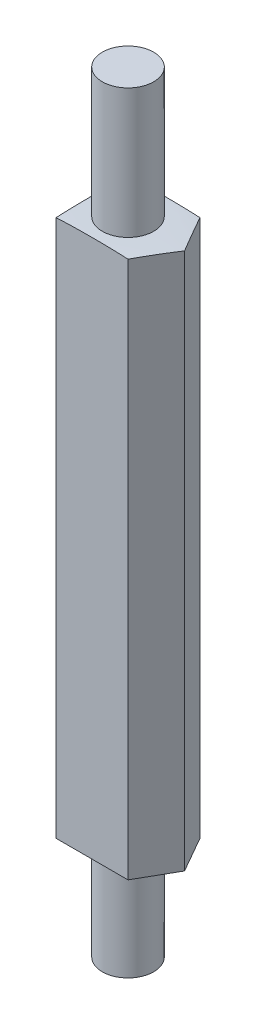
ISO-10303-21;
HEADER;
FILE_DESCRIPTION(('STEP AP214'),'2;1');
FILE_NAME('part.step','',(''),(''),'','','');
FILE_SCHEMA(('AUTOMOTIVE_DESIGN { 1 0 10303 214 1 1 1 1 }'));
ENDSEC;
DATA;
#1=APPLICATION_CONTEXT('core data for automotive mechanical design processes');
#2=APPLICATION_PROTOCOL_DEFINITION('international standard','automotive_design',2000,#1);
#3=PRODUCT_CONTEXT('',#1,'mechanical');
#4=PRODUCT('Part','Part','',(#3));
#5=PRODUCT_RELATED_PRODUCT_CATEGORY('part','',(#4));
#6=PRODUCT_DEFINITION_FORMATION('','',#4);
#7=PRODUCT_DEFINITION_CONTEXT('part definition',#1,'design');
#8=PRODUCT_DEFINITION('design','',#6,#7);
#9=PRODUCT_DEFINITION_SHAPE('','',#8);
#10=(LENGTH_UNIT() NAMED_UNIT(*) SI_UNIT(.MILLI.,.METRE.));
#11=(NAMED_UNIT(*) PLANE_ANGLE_UNIT() SI_UNIT($,.RADIAN.));
#12=(NAMED_UNIT(*) SI_UNIT($,.STERADIAN.) SOLID_ANGLE_UNIT());
#13=UNCERTAINTY_MEASURE_WITH_UNIT(LENGTH_MEASURE(1.E-05),#10,'distance_accuracy_value','');
#14=(GEOMETRIC_REPRESENTATION_CONTEXT(3) GLOBAL_UNCERTAINTY_ASSIGNED_CONTEXT((#13)) GLOBAL_UNIT_ASSIGNED_CONTEXT((#10,
#11,#12)) REPRESENTATION_CONTEXT('',''));
#15=CARTESIAN_POINT('',(0.,0.,0.));
#16=DIRECTION('',(0.,0.,1.));
#17=DIRECTION('',(1.,0.,0.));
#18=AXIS2_PLACEMENT_3D('',#15,#16,#17);
#19=CARTESIAN_POINT('',(0.,44.8,0.));
#20=DIRECTION('',(0.,-1.,0.));
#21=DIRECTION('',(0.,0.,1.));
#22=AXIS2_PLACEMENT_3D('',#19,#20,#21);
#23=DEGENERATE_TOROIDAL_SURFACE('',#22,5.00000000000002,60.,.T.);
#24=CARTESIAN_POINT('',(-35.4807056837129,96.0714913568184,-7.));
#25=CARTESIAN_POINT('',(-34.7704602372961,96.49505391938,-7.));
#26=CARTESIAN_POINT('',(-34.0514374149317,96.9038920899398,-7.));
#27=CARTESIAN_POINT('',(-32.597126199639,97.6914925336975,-7.));
#28=CARTESIAN_POINT('',(-31.8618382031194,98.0702555388455,-7.));
#29=CARTESIAN_POINT('',(-30.3749060560666,98.7977573102285,-7.));
#30=CARTESIAN_POINT('',(-29.6232346986543,99.1464404662368,-7.));
#31=CARTESIAN_POINT('',(-28.1061283770773,99.8124841908434,-7.));
#32=CARTESIAN_POINT('',(-27.3406932095398,100.129844296165,-7.));
#33=CARTESIAN_POINT('',(-25.7980679917241,100.732517194497,-7.));
#34=CARTESIAN_POINT('',(-25.0208885953051,101.017857261764,-7.));
#35=CARTESIAN_POINT('',(-23.4555177200102,101.556425468979,-7.));
#36=CARTESIAN_POINT('',(-22.667326682778,101.809654892708,-7.));
#37=CARTESIAN_POINT('',(-21.0824187831595,102.283415888684,-7.));
#38=CARTESIAN_POINT('',(-20.2857158023585,102.503993931897,-7.));
#39=CARTESIAN_POINT('',(-18.6839303270961,102.912798037602,-7.));
#40=CARTESIAN_POINT('',(-17.878846722126,103.10101975319,-7.));
#41=CARTESIAN_POINT('',(-16.4601673648762,103.402944054347,-7.));
#42=CARTESIAN_POINT('',(-15.8480401862005,103.523600752918,-7.));
#43=CARTESIAN_POINT('',(-14.6204708078111,103.746660971418,-7.));
#44=CARTESIAN_POINT('',(-14.0050286400032,103.849064666704,-7.));
#45=CARTESIAN_POINT('',(-12.7714919846752,104.035887047731,-7.));
#46=CARTESIAN_POINT('',(-12.1533977775346,104.120307589115,-7.));
#47=CARTESIAN_POINT('',(-10.9150842307115,104.271661975545,-7.));
#48=CARTESIAN_POINT('',(-10.2948649120304,104.338595992898,-7.));
#49=CARTESIAN_POINT('',(-9.05109061822959,104.455946089074,-7.));
#50=CARTESIAN_POINT('',(-8.42753117459116,104.506314516893,-7.));
#51=CARTESIAN_POINT('',(-7.17937113919081,104.591575298752,-7.));
#52=CARTESIAN_POINT('',(-6.55477055135328,104.626467710994,-7.));
#53=CARTESIAN_POINT('',(-5.30480983647563,104.682807824537,-7.));
#54=CARTESIAN_POINT('',(-4.67944954798173,104.704251831856,-7.00000000000001));
#55=CARTESIAN_POINT('',(-3.42846119692229,104.736593850282,-7.00000000000001));
#56=CARTESIAN_POINT('',(-2.80283312942295,104.747491657898,-7.));
#57=CARTESIAN_POINT('',(-1.86381971453881,104.758328886007,-7.00000000000001));
#58=CARTESIAN_POINT('',(-1.5504602028737,104.761022990333,-7.00000000000001));
#59=CARTESIAN_POINT('',(-0.923731211433339,104.764859728087,-7.00000000000001));
#60=CARTESIAN_POINT('',(-0.610361731657584,104.766002361438,-7.00000000000001));
#61=CARTESIAN_POINT('',(0.0163794553882462,104.766891718648,-7.00000000000001));
#62=CARTESIAN_POINT('',(0.329751162660568,104.766638440809,-7.00000000000001));
#63=CARTESIAN_POINT('',(0.956489672090149,104.764695357435,-7.00000000000001));
#64=CARTESIAN_POINT('',(1.2698564742473,104.763005551867,-7.00000000000001));
#65=CARTESIAN_POINT('',(2.2098696019706,104.75548808701,-7.00000000000001));
#66=CARTESIAN_POINT('',(2.83650100265556,104.747212554719,-7.00000000000001));
#67=CARTESIAN_POINT('',(4.08956851822759,104.721134489193,-7.00000000000001));
#68=CARTESIAN_POINT('',(4.71600463680264,104.703332148346,-7.00000000000001));
#69=CARTESIAN_POINT('',(5.96702324365867,104.655097305368,-7.00000000000001));
#70=CARTESIAN_POINT('',(6.59160676867303,104.624692805798,-7.00000000000001));
#71=CARTESIAN_POINT('',(7.83988746239251,104.548967859024,-7.00000000000001));
#72=CARTESIAN_POINT('',(8.46358462481576,104.50364730663,-7.00000000000001));
#73=CARTESIAN_POINT('',(9.70947533513393,104.396591956521,-7.00000000000001));
#74=CARTESIAN_POINT('',(10.3316691225465,104.334859975081,-7.00000000000001));
#75=CARTESIAN_POINT('',(11.5740751772015,104.194047974128,-7.00000000000001));
#76=CARTESIAN_POINT('',(12.194287473447,104.114968209725,-7.00000000000001));
#77=CARTESIAN_POINT('',(13.8117819250366,103.88486006564,-7.00000000000001));
#78=CARTESIAN_POINT('',(14.8070627646019,103.719448689205,-7.00000000000001));
#79=CARTESIAN_POINT('',(16.7885426974355,103.340695638787,-7.00000000000001));
#80=CARTESIAN_POINT('',(17.7747409758519,103.127349707081,-7.00000000000001));
#81=CARTESIAN_POINT('',(19.7363113179881,102.652211092633,-7.00000000000001));
#82=CARTESIAN_POINT('',(20.7116733754322,102.390377032747,-7.00000000000001));
#83=CARTESIAN_POINT('',(22.6481388471026,101.818547728553,-7.00000000000001));
#84=CARTESIAN_POINT('',(23.6092428255693,101.50855439567,-7.00000000000001));
#85=CARTESIAN_POINT('',(25.5115031707594,100.842010692062,-7.00000000000001));
#86=CARTESIAN_POINT('',(26.4527162583502,100.485622232716,-7.00000000000001));
#87=CARTESIAN_POINT('',(28.3161315509829,99.7261800127529,-7.00000000000001));
#88=CARTESIAN_POINT('',(29.2383336756878,99.323126054984,-7.00000000000001));
#89=CARTESIAN_POINT('',(31.0612405452625,98.4712850570906,-7.00000000000001));
#90=CARTESIAN_POINT('',(31.9619477688597,98.0225033219165,-7.00000000000001));
#91=CARTESIAN_POINT('',(33.7396707909722,97.0802472328056,-7.00000000000001));
#92=CARTESIAN_POINT('',(34.6166866219999,96.586772940206,-7.00000000000001));
#93=CARTESIAN_POINT('',(35.4807056837128,96.0714913568184,-7.00000000000002));
#94=B_SPLINE_CURVE_WITH_KNOTS('',3,(#24,#25,#26,#27,#28,#29,#30,#31,#32,#33,#34,#35,#36,#37,#38,
#39,#40,#41,#42,#43,#44,#45,#46,#47,#48,#49,#50,#51,#52,#53,#54,#55,#56,#57,#58,#59,#60,#61,#62,
#63,#64,#65,#66,#67,#68,#69,#70,#71,#72,#73,#74,#75,#76,#77,#78,#79,#80,#81,#82,#83,#84,#85,#86,
#87,#88,#89,#90,#91,#92,#93),.UNSPECIFIED.,.F.,.F.,(4,2,2,2,2,2,2,2,2,2,2,2,2,2,2,2,2,2,2,2,2,2,
2,2,2,2,2,2,2,2,2,2,2,2,4),(0.,2.48068189157886,4.96130339139055,7.44641683002163,
9.93156701867196,12.4145840577446,14.8975017947894,17.3768510303997,19.8565330937413,
21.7279859418865,23.5994208099274,25.470662474853,27.3418857003034,29.2184453674426,
31.0949979771783,32.9720658090746,34.8491698584172,35.7892807343555,36.729391656888,
37.669503723195,38.6096158106664,40.4896229316514,42.3695920885385,44.245406076272,
46.1212332927393,47.9967388163297,49.872216761132,52.8977959569839,55.9236440022057,
58.9520861413772,61.9804081134466,64.9984316797057,68.0164679969994,71.0341545850014,
74.0518370315093),.UNSPECIFIED.);
#95=CARTESIAN_POINT('',(-7.00000000000003,104.599623321273,-7.));
#96=VERTEX_POINT('',#95);
#97=CARTESIAN_POINT('',(6.99999999999998,104.599623321273,-7.00000000000001));
#98=VERTEX_POINT('',#97);
#99=EDGE_CURVE('E106',#96,#98,#94,.T.);
#100=ORIENTED_EDGE('',*,*,#99,.F.);
#101=CARTESIAN_POINT('',(-7.00000000000003,96.0714913568184,35.4807056837128));
#102=CARTESIAN_POINT('',(-7.00000000000003,96.49505391938,34.770460237296));
#103=CARTESIAN_POINT('',(-7.00000000000003,96.9038920899398,34.0514374149317));
#104=CARTESIAN_POINT('',(-7.00000000000003,97.6914925336975,32.597126199639));
#105=CARTESIAN_POINT('',(-7.00000000000003,98.0702555388455,31.8618382031193));
#106=CARTESIAN_POINT('',(-7.00000000000003,98.7977573102285,30.3749060560665));
#107=CARTESIAN_POINT('',(-7.00000000000003,99.1464404662369,29.6232346986543));
#108=CARTESIAN_POINT('',(-7.00000000000003,99.8124841908434,28.1061283770772));
#109=CARTESIAN_POINT('',(-7.00000000000003,100.129844296165,27.3406932095397));
#110=CARTESIAN_POINT('',(-7.00000000000003,100.732517194497,25.798067991724));
#111=CARTESIAN_POINT('',(-7.00000000000003,101.017857261764,25.0208885953051));
#112=CARTESIAN_POINT('',(-7.00000000000003,101.556425468979,23.4555177200102));
#113=CARTESIAN_POINT('',(-7.00000000000003,101.809654892708,22.6673266827779));
#114=CARTESIAN_POINT('',(-7.00000000000003,102.283415888684,21.0824187831594));
#115=CARTESIAN_POINT('',(-7.00000000000003,102.503993931897,20.2857158023585));
#116=CARTESIAN_POINT('',(-7.00000000000003,102.912798037602,18.6839303270961));
#117=CARTESIAN_POINT('',(-7.00000000000003,103.10101975319,17.878846722126));
#118=CARTESIAN_POINT('',(-7.00000000000003,103.402944054347,16.4601673648762));
#119=CARTESIAN_POINT('',(-7.00000000000003,103.523600752918,15.8480401862005));
#120=CARTESIAN_POINT('',(-7.00000000000003,103.746660971418,14.6204708078111));
#121=CARTESIAN_POINT('',(-7.00000000000003,103.849064666704,14.0050286400032));
#122=CARTESIAN_POINT('',(-7.00000000000003,104.035887047731,12.7714919846751));
#123=CARTESIAN_POINT('',(-7.00000000000003,104.120307589115,12.1533977775346));
#124=CARTESIAN_POINT('',(-7.00000000000003,104.271661975545,10.9150842307115));
#125=CARTESIAN_POINT('',(-7.00000000000003,104.338595992898,10.2948649120304));
#126=CARTESIAN_POINT('',(-7.00000000000003,104.455946089074,9.05109061822957));
#127=CARTESIAN_POINT('',(-7.00000000000003,104.506314516893,8.42753117459114));
#128=CARTESIAN_POINT('',(-7.00000000000003,104.591575298752,7.17937113919079));
#129=CARTESIAN_POINT('',(-7.00000000000003,104.626467710994,6.55477055135326));
#130=CARTESIAN_POINT('',(-7.00000000000003,104.682807824537,5.30480983647561));
#131=CARTESIAN_POINT('',(-7.00000000000003,104.704251831856,4.67944954798171));
#132=CARTESIAN_POINT('',(-7.00000000000003,104.736593850282,3.42846119692227));
#133=CARTESIAN_POINT('',(-7.00000000000003,104.747491657898,2.80283312942293));
#134=CARTESIAN_POINT('',(-7.00000000000003,104.758328886007,1.86381971453879));
#135=CARTESIAN_POINT('',(-7.00000000000003,104.761022990333,1.55046020287368));
#136=CARTESIAN_POINT('',(-7.00000000000003,104.764859728087,0.923731211433315));
#137=CARTESIAN_POINT('',(-7.00000000000003,104.766002361438,0.61036173165756));
#138=CARTESIAN_POINT('',(-7.00000000000003,104.766891718648,-0.0163794553882718));
#139=CARTESIAN_POINT('',(-7.00000000000003,104.766638440809,-0.329751162660594));
#140=CARTESIAN_POINT('',(-7.00000000000003,104.764695357435,-0.956489672090177));
#141=CARTESIAN_POINT('',(-7.00000000000003,104.763005551867,-1.26985647424733));
#142=CARTESIAN_POINT('',(-7.00000000000003,104.75548808701,-2.20986960197063));
#143=CARTESIAN_POINT('',(-7.00000000000003,104.747212554719,-2.83650100265559));
#144=CARTESIAN_POINT('',(-7.00000000000003,104.721134489193,-4.08956851822761));
#145=CARTESIAN_POINT('',(-7.00000000000003,104.703332148346,-4.71600463680267));
#146=CARTESIAN_POINT('',(-7.00000000000003,104.655097305368,-5.9670232436587));
#147=CARTESIAN_POINT('',(-7.00000000000003,104.624692805798,-6.59160676867305));
#148=CARTESIAN_POINT('',(-7.00000000000003,104.548967859024,-7.83988746239254));
#149=CARTESIAN_POINT('',(-7.00000000000003,104.50364730663,-8.46358462481579));
#150=CARTESIAN_POINT('',(-7.00000000000003,104.396591956521,-9.70947533513396));
#151=CARTESIAN_POINT('',(-7.00000000000003,104.334859975081,-10.3316691225465));
#152=CARTESIAN_POINT('',(-7.00000000000003,104.194047974128,-11.5740751772015));
#153=CARTESIAN_POINT('',(-7.00000000000003,104.114968209725,-12.194287473447));
#154=CARTESIAN_POINT('',(-7.00000000000003,103.88486006564,-13.8117819250366));
#155=CARTESIAN_POINT('',(-7.00000000000003,103.719448689205,-14.8070627646019));
#156=CARTESIAN_POINT('',(-7.00000000000003,103.340695638787,-16.7885426974355));
#157=CARTESIAN_POINT('',(-7.00000000000003,103.127349707081,-17.7747409758519));
#158=CARTESIAN_POINT('',(-7.00000000000003,102.652211092633,-19.7363113179882));
#159=CARTESIAN_POINT('',(-7.00000000000003,102.390377032747,-20.7116733754322));
#160=CARTESIAN_POINT('',(-7.00000000000003,101.818547728553,-22.6481388471026));
#161=CARTESIAN_POINT('',(-7.00000000000003,101.50855439567,-23.6092428255693));
#162=CARTESIAN_POINT('',(-7.00000000000003,100.842010692062,-25.5115031707594));
#163=CARTESIAN_POINT('',(-7.00000000000003,100.485622232716,-26.4527162583502));
#164=CARTESIAN_POINT('',(-7.00000000000003,99.7261800127529,-28.316131550983));
#165=CARTESIAN_POINT('',(-7.00000000000003,99.323126054984,-29.2383336756879));
#166=CARTESIAN_POINT('',(-7.00000000000003,98.4712850570906,-31.0612405452625));
#167=CARTESIAN_POINT('',(-7.00000000000003,98.0225033219165,-31.9619477688598));
#168=CARTESIAN_POINT('',(-7.00000000000003,97.0802472328056,-33.7396707909722));
#169=CARTESIAN_POINT('',(-7.00000000000003,96.586772940206,-34.6166866219999));
#170=CARTESIAN_POINT('',(-7.00000000000003,96.0714913568184,-35.4807056837128));
#171=B_SPLINE_CURVE_WITH_KNOTS('',3,(#101,#102,#103,#104,#105,#106,#107,#108,#109,#110,#111,
#112,#113,#114,#115,#116,#117,#118,#119,#120,#121,#122,#123,#124,#125,#126,#127,#128,#129,#130,
#131,#132,#133,#134,#135,#136,#137,#138,#139,#140,#141,#142,#143,#144,#145,#146,#147,#148,#149,
#150,#151,#152,#153,#154,#155,#156,#157,#158,#159,#160,#161,#162,#163,#164,#165,#166,#167,#168,
#169,#170),.UNSPECIFIED.,.F.,.F.,(4,2,2,2,2,2,2,2,2,2,2,2,2,2,2,2,2,2,2,2,2,2,2,2,2,2,2,2,2,2,2,
2,2,2,4),(0.,2.48068189157885,4.96130339139056,7.44641683002164,9.93156701867196,
12.4145840577446,14.8975017947894,17.3768510303997,19.8565330937413,21.7279859418865,
23.5994208099274,25.470662474853,27.3418857003034,29.2184453674426,31.0949979771783,
32.9720658090746,34.8491698584172,35.7892807343555,36.729391656888,37.669503723195,
38.6096158106664,40.4896229316514,42.3695920885385,44.245406076272,46.1212332927393,
47.9967388163297,49.872216761132,52.8977959569839,55.9236440022057,58.9520861413772,
61.9804081134466,64.9984316797057,68.0164679969994,71.0341545850013,74.0518370315093),.UNSPECIFIED.);
#172=CARTESIAN_POINT('',(-7.00000000000003,104.599623321273,6.99999999999999));
#173=VERTEX_POINT('',#172);
#174=EDGE_CURVE('E92',#173,#96,#171,.T.);
#175=ORIENTED_EDGE('',*,*,#174,.F.);
#176=CARTESIAN_POINT('',(35.4807056837128,96.0714913568184,7.));
#177=CARTESIAN_POINT('',(34.770460237296,96.49505391938,7.));
#178=CARTESIAN_POINT('',(34.0514374149317,96.9038920899398,7.));
#179=CARTESIAN_POINT('',(32.597126199639,97.6914925336975,7.));
#180=CARTESIAN_POINT('',(31.8618382031193,98.0702555388455,7.));
#181=CARTESIAN_POINT('',(30.3749060560665,98.7977573102285,7.));
#182=CARTESIAN_POINT('',(29.6232346986543,99.1464404662369,7.));
#183=CARTESIAN_POINT('',(28.1061283770772,99.8124841908434,7.));
#184=CARTESIAN_POINT('',(27.3406932095397,100.129844296165,7.));
#185=CARTESIAN_POINT('',(25.798067991724,100.732517194497,7.));
#186=CARTESIAN_POINT('',(25.0208885953051,101.017857261764,7.));
#187=CARTESIAN_POINT('',(23.4555177200102,101.556425468979,7.));
#188=CARTESIAN_POINT('',(22.6673266827779,101.809654892708,7.));
#189=CARTESIAN_POINT('',(21.0824187831594,102.283415888684,7.));
#190=CARTESIAN_POINT('',(20.2857158023585,102.503993931897,7.));
#191=CARTESIAN_POINT('',(18.6839303270961,102.912798037602,7.));
#192=CARTESIAN_POINT('',(17.878846722126,103.10101975319,7.));
#193=CARTESIAN_POINT('',(16.4601673648762,103.402944054347,7.));
#194=CARTESIAN_POINT('',(15.8480401862005,103.523600752918,7.));
#195=CARTESIAN_POINT('',(14.6204708078111,103.746660971418,7.));
#196=CARTESIAN_POINT('',(14.0050286400032,103.849064666704,7.));
#197=CARTESIAN_POINT('',(12.7714919846751,104.035887047731,7.));
#198=CARTESIAN_POINT('',(12.1533977775346,104.120307589115,6.99999999999999));
#199=CARTESIAN_POINT('',(10.9150842307115,104.271661975545,6.99999999999999));
#200=CARTESIAN_POINT('',(10.2948649120304,104.338595992898,6.99999999999999));
#201=CARTESIAN_POINT('',(9.05109061822955,104.455946089074,6.99999999999999));
#202=CARTESIAN_POINT('',(8.42753117459113,104.506314516893,6.99999999999999));
#203=CARTESIAN_POINT('',(7.17937113919078,104.591575298752,6.99999999999999));
#204=CARTESIAN_POINT('',(6.55477055135324,104.626467710994,6.99999999999999));
#205=CARTESIAN_POINT('',(5.30480983647558,104.682807824537,6.99999999999999));
#206=CARTESIAN_POINT('',(4.67944954798168,104.704251831856,6.99999999999999));
#207=CARTESIAN_POINT('',(3.42846119692224,104.736593850282,6.99999999999999));
#208=CARTESIAN_POINT('',(2.80283312942291,104.747491657898,6.99999999999999));
#209=CARTESIAN_POINT('',(1.86381971453876,104.758328886007,6.99999999999999));
#210=CARTESIAN_POINT('',(1.55046020287366,104.761022990333,6.99999999999999));
#211=CARTESIAN_POINT('',(0.923731211433291,104.764859728087,6.99999999999999));
#212=CARTESIAN_POINT('',(0.610361731657538,104.766002361438,6.99999999999999));
#213=CARTESIAN_POINT('',(-0.0163794553882921,104.766891718648,6.99999999999999));
#214=CARTESIAN_POINT('',(-0.329751162660616,104.766638440809,6.99999999999999));
#215=CARTESIAN_POINT('',(-0.9564896720902,104.764695357435,6.99999999999999));
#216=CARTESIAN_POINT('',(-1.26985647424735,104.763005551867,6.99999999999999));
#217=CARTESIAN_POINT('',(-2.20986960197065,104.75548808701,6.99999999999999));
#218=CARTESIAN_POINT('',(-2.83650100265562,104.747212554719,6.99999999999999));
#219=CARTESIAN_POINT('',(-4.08956851822764,104.721134489193,6.99999999999999));
#220=CARTESIAN_POINT('',(-4.71600463680269,104.703332148346,6.99999999999999));
#221=CARTESIAN_POINT('',(-5.96702324365873,104.655097305368,6.99999999999999));
#222=CARTESIAN_POINT('',(-6.59160676867308,104.624692805798,6.99999999999999));
#223=CARTESIAN_POINT('',(-7.83988746239256,104.548967859024,6.99999999999999));
#224=CARTESIAN_POINT('',(-8.46358462481581,104.50364730663,6.99999999999999));
#225=CARTESIAN_POINT('',(-9.70947533513398,104.396591956521,6.99999999999999));
#226=CARTESIAN_POINT('',(-10.3316691225466,104.334859975081,6.99999999999999));
#227=CARTESIAN_POINT('',(-11.5740751772015,104.194047974128,6.99999999999999));
#228=CARTESIAN_POINT('',(-12.194287473447,104.114968209725,6.99999999999999));
#229=CARTESIAN_POINT('',(-13.8117819250366,103.88486006564,6.99999999999999));
#230=CARTESIAN_POINT('',(-14.807062764602,103.719448689205,6.99999999999999));
#231=CARTESIAN_POINT('',(-16.7885426974355,103.340695638787,6.99999999999999));
#232=CARTESIAN_POINT('',(-17.7747409758519,103.127349707081,6.99999999999999));
#233=CARTESIAN_POINT('',(-19.7363113179882,102.652211092633,6.99999999999999));
#234=CARTESIAN_POINT('',(-20.7116733754322,102.390377032747,6.99999999999999));
#235=CARTESIAN_POINT('',(-22.6481388471026,101.818547728553,6.99999999999999));
#236=CARTESIAN_POINT('',(-23.6092428255693,101.50855439567,6.99999999999999));
#237=CARTESIAN_POINT('',(-25.5115031707594,100.842010692062,6.99999999999999));
#238=CARTESIAN_POINT('',(-26.4527162583502,100.485622232716,6.99999999999999));
#239=CARTESIAN_POINT('',(-28.316131550983,99.7261800127529,6.99999999999999));
#240=CARTESIAN_POINT('',(-29.2383336756879,99.3231260549839,6.99999999999998));
#241=CARTESIAN_POINT('',(-31.0612405452625,98.4712850570905,6.99999999999998));
#242=CARTESIAN_POINT('',(-31.9619477688598,98.0225033219165,6.99999999999998));
#243=CARTESIAN_POINT('',(-33.7396707909722,97.0802472328056,6.99999999999998));
#244=CARTESIAN_POINT('',(-34.616686622,96.586772940206,6.99999999999998));
#245=CARTESIAN_POINT('',(-35.4807056837129,96.0714913568184,6.99999999999998));
#246=B_SPLINE_CURVE_WITH_KNOTS('',3,(#176,#177,#178,#179,#180,#181,#182,#183,#184,#185,#186,
#187,#188,#189,#190,#191,#192,#193,#194,#195,#196,#197,#198,#199,#200,#201,#202,#203,#204,#205,
#206,#207,#208,#209,#210,#211,#212,#213,#214,#215,#216,#217,#218,#219,#220,#221,#222,#223,#224,
#225,#226,#227,#228,#229,#230,#231,#232,#233,#234,#235,#236,#237,#238,#239,#240,#241,#242,#243,
#244,#245),.UNSPECIFIED.,.F.,.F.,(4,2,2,2,2,2,2,2,2,2,2,2,2,2,2,2,2,2,2,2,2,2,2,2,2,2,2,2,2,2,2,
2,2,2,4),(0.,2.48068189157884,4.96130339139054,7.44641683002161,9.93156701867194,
12.4145840577446,14.8975017947893,17.3768510303997,19.8565330937413,21.7279859418865,
23.5994208099274,25.470662474853,27.3418857003033,29.2184453674426,31.0949979771783,
32.9720658090746,34.8491698584172,35.7892807343555,36.729391656888,37.669503723195,
38.6096158106664,40.4896229316514,42.3695920885385,44.245406076272,46.1212332927393,
47.9967388163297,49.872216761132,52.8977959569839,55.9236440022057,58.9520861413772,
61.9804081134466,64.9984316797057,68.0164679969995,71.0341545850014,74.0518370315093),.UNSPECIFIED.);
#247=CARTESIAN_POINT('',(6.99999999999998,104.599623321273,6.99999999999999));
#248=VERTEX_POINT('',#247);
#249=EDGE_CURVE('E83',#248,#173,#246,.T.);
#250=ORIENTED_EDGE('',*,*,#249,.F.);
#251=CARTESIAN_POINT('',(11.0001142857143,104.499234739958,-0.000200000000007339));
#252=CARTESIAN_POINT('',(10.8335659396209,104.515976763209,0.291259605663315));
#253=CARTESIAN_POINT('',(10.6669740169347,104.530851205526,0.58279547036424));
#254=CARTESIAN_POINT('',(10.3337260818348,104.55714029033,1.16597935678904));
#255=CARTESIAN_POINT('',(10.1670700707665,104.568555001855,1.45762737615857));
#256=CARTESIAN_POINT('',(9.6671312060022,104.598017515691,2.3325203894961));
#257=CARTESIAN_POINT('',(9.33377689705853,104.611293476327,2.91589043014751));
#258=CARTESIAN_POINT('',(8.83371345516731,104.62288041425,3.79100145345716));
#259=CARTESIAN_POINT('',(8.66702315550597,104.625354921863,4.08270947786449));
#260=CARTESIAN_POINT('',(8.33363791336234,104.627602463484,4.66613365161585));
#261=CARTESIAN_POINT('',(8.16694297089873,104.627375507132,4.95784980092717));
#262=CARTESIAN_POINT('',(7.83350966874269,104.624219594798,5.54135807970025));
#263=CARTESIAN_POINT('',(7.6667713109416,104.62128983236,5.83315020585215));
#264=CARTESIAN_POINT('',(7.33331219522816,104.612604311848,6.41670365835068));
#265=CARTESIAN_POINT('',(7.16659143738181,104.606848543527,6.70846498458178));
#266=CARTESIAN_POINT('',(6.99988571428569,104.599618355216,7.00019999999999));
#267=B_SPLINE_CURVE_WITH_KNOTS('',3,(#251,#252,#253,#254,#255,#256,#257,#258,#259,#260,#261,
#262,#263,#264,#265,#266),.UNSPECIFIED.,.F.,.F.,(4,2,2,2,2,2,2,4),(0.,1.00830439187766,
2.01658866172778,4.03254815752321,5.04049351443931,6.04843527455549,7.05667787828032,
8.0649241376618),.UNSPECIFIED.);
#268=CARTESIAN_POINT('',(11.,104.499246226397,0.));
#269=VERTEX_POINT('',#268);
#270=EDGE_CURVE('E101',#269,#248,#267,.T.);
#271=ORIENTED_EDGE('',*,*,#270,.F.);
#272=CARTESIAN_POINT('',(6.99988571428569,104.599618355216,-7.00020000000001));
#273=CARTESIAN_POINT('',(7.16659143738181,104.606848543527,-6.70846498458179));
#274=CARTESIAN_POINT('',(7.33331219522816,104.612604311848,-6.41670365835069));
#275=CARTESIAN_POINT('',(7.6667713109416,104.62128983236,-5.83315020585216));
#276=CARTESIAN_POINT('',(7.83350966874269,104.624219594798,-5.54135807970026));
#277=CARTESIAN_POINT('',(8.16694297089873,104.627375507132,-4.95784980092718));
#278=CARTESIAN_POINT('',(8.33363791336234,104.627602463484,-4.66613365161586));
#279=CARTESIAN_POINT('',(8.66702315550598,104.625354921863,-4.0827094778645));
#280=CARTESIAN_POINT('',(8.83371345516731,104.62288041425,-3.79100145345717));
#281=CARTESIAN_POINT('',(9.33377689705854,104.611293476327,-2.91589043014752));
#282=CARTESIAN_POINT('',(9.6671312060022,104.598017515691,-2.33252038949611));
#283=CARTESIAN_POINT('',(10.1670700707665,104.568555001855,-1.45762737615858));
#284=CARTESIAN_POINT('',(10.3337260818348,104.55714029033,-1.16597935678905));
#285=CARTESIAN_POINT('',(10.6669740169347,104.530851205526,-0.582795470364252));
#286=CARTESIAN_POINT('',(10.8335659396209,104.515976763209,-0.291259605663327));
#287=CARTESIAN_POINT('',(11.0001142857143,104.499234739958,0.000199999999995854));
#288=B_SPLINE_CURVE_WITH_KNOTS('',3,(#272,#273,#274,#275,#276,#277,#278,#279,#280,#281,#282,
#283,#284,#285,#286,#287),.UNSPECIFIED.,.F.,.F.,(4,2,2,2,2,2,2,4),(0.,1.00824625938149,
2.01648886310632,3.02443062322249,4.0323759801386,6.04833547593403,7.05661974578415,
8.0649241376618),.UNSPECIFIED.);
#289=EDGE_CURVE('E108',#98,#269,#288,.T.);
#290=ORIENTED_EDGE('',*,*,#289,.F.);
#291=EDGE_LOOP('',(#100,#175,#250,#271,#290));
#292=FACE_BOUND('',#291,.T.);
#293=CARTESIAN_POINT('',(0.,104.8,0.));
#294=DIRECTION('',(0.,-1.,0.));
#295=DIRECTION('',(0.,0.,-1.));
#296=AXIS2_PLACEMENT_3D('',#293,#294,#295);
#297=CIRCLE('',#296,5.00000000000003);
#298=CARTESIAN_POINT('',(0.,104.8,-5.00000000000003));
#299=VERTEX_POINT('',#298);
#300=EDGE_CURVE('E93',#299,#299,#297,.F.);
#301=ORIENTED_EDGE('',*,*,#300,.F.);
#302=EDGE_LOOP('',(#301));
#303=FACE_BOUND('',#302,.T.);
#304=ADVANCED_FACE('F39',(#292,#303),#23,.T.);
#305=CARTESIAN_POINT('',(-7.00000000000003,104.802,6.99999999999999));
#306=DIRECTION('',(-1.,0.,0.));
#307=DIRECTION('',(0.,0.,1.));
#308=AXIS2_PLACEMENT_3D('',#305,#306,#307);
#309=PLANE('',#308);
#310=DIRECTION('',(0.,-1.,0.));
#311=VECTOR('',#310,1.);
#312=CARTESIAN_POINT('',(-7.00000000000003,104.802,6.99999999999999));
#313=LINE('',#312,#311);
#314=CARTESIAN_POINT('',(-7.00000000000003,0.,6.99999999999999));
#315=VERTEX_POINT('',#314);
#316=EDGE_CURVE('E86',#173,#315,#313,.T.);
#317=ORIENTED_EDGE('',*,*,#316,.F.);
#318=ORIENTED_EDGE('',*,*,#174,.T.);
#319=DIRECTION('',(0.,-1.,0.));
#320=VECTOR('',#319,1.);
#321=CARTESIAN_POINT('',(-7.00000000000003,104.802,-7.));
#322=LINE('',#321,#320);
#323=CARTESIAN_POINT('',(-7.00000000000003,0.,-7.));
#324=VERTEX_POINT('',#323);
#325=EDGE_CURVE('E100',#96,#324,#322,.T.);
#326=ORIENTED_EDGE('',*,*,#325,.T.);
#327=DIRECTION('',(0.,0.,-1.));
#328=VECTOR('',#327,1.);
#329=CARTESIAN_POINT('',(-7.00000000000003,0.,6.99999999999999));
#330=LINE('',#329,#328);
#331=EDGE_CURVE('E99',#315,#324,#330,.T.);
#332=ORIENTED_EDGE('',*,*,#331,.F.);
#333=EDGE_LOOP('',(#317,#318,#326,#332));
#334=FACE_BOUND('',#333,.T.);
#335=ADVANCED_FACE('F96',(#334),#309,.T.);
#336=CARTESIAN_POINT('',(-7.00000000000003,104.802,-7.));
#337=DIRECTION('',(0.,0.,-1.));
#338=DIRECTION('',(-1.,0.,0.));
#339=AXIS2_PLACEMENT_3D('',#336,#337,#338);
#340=PLANE('',#339);
#341=ORIENTED_EDGE('',*,*,#325,.F.);
#342=ORIENTED_EDGE('',*,*,#99,.T.);
#343=DIRECTION('',(0.,-1.,0.));
#344=VECTOR('',#343,1.);
#345=CARTESIAN_POINT('',(6.99999999999998,104.802,-7.00000000000001));
#346=LINE('',#345,#344);
#347=CARTESIAN_POINT('',(6.99999999999998,0.,-7.00000000000001));
#348=VERTEX_POINT('',#347);
#349=EDGE_CURVE('E184',#98,#348,#346,.T.);
#350=ORIENTED_EDGE('',*,*,#349,.T.);
#351=DIRECTION('',(1.,0.,0.));
#352=VECTOR('',#351,1.);
#353=CARTESIAN_POINT('',(-7.00000000000003,0.,-7.));
#354=LINE('',#353,#352);
#355=EDGE_CURVE('E183',#324,#348,#354,.T.);
#356=ORIENTED_EDGE('',*,*,#355,.F.);
#357=EDGE_LOOP('',(#341,#342,#350,#356));
#358=FACE_BOUND('',#357,.T.);
#359=ADVANCED_FACE('F154',(#358),#340,.T.);
#360=CARTESIAN_POINT('',(6.99999999999998,104.802,6.99999999999999));
#361=DIRECTION('',(0.,0.,1.));
#362=DIRECTION('',(1.,0.,0.));
#363=AXIS2_PLACEMENT_3D('',#360,#361,#362);
#364=PLANE('',#363);
#365=DIRECTION('',(0.,-1.,0.));
#366=VECTOR('',#365,1.);
#367=CARTESIAN_POINT('',(6.99999999999998,104.802,6.99999999999999));
#368=LINE('',#367,#366);
#369=CARTESIAN_POINT('',(6.99999999999997,0.,6.99999999999999));
#370=VERTEX_POINT('',#369);
#371=EDGE_CURVE('E88',#248,#370,#368,.T.);
#372=ORIENTED_EDGE('',*,*,#371,.F.);
#373=ORIENTED_EDGE('',*,*,#249,.T.);
#374=ORIENTED_EDGE('',*,*,#316,.T.);
#375=DIRECTION('',(-1.,0.,0.));
#376=VECTOR('',#375,1.);
#377=CARTESIAN_POINT('',(6.99999999999998,0.,6.99999999999999));
#378=LINE('',#377,#376);
#379=EDGE_CURVE('E46',#370,#315,#378,.T.);
#380=ORIENTED_EDGE('',*,*,#379,.F.);
#381=EDGE_LOOP('',(#372,#373,#374,#380));
#382=FACE_BOUND('',#381,.T.);
#383=ADVANCED_FACE('F85',(#382),#364,.T.);
#384=CARTESIAN_POINT('',(6.99999999999998,104.802,-7.00000000000001));
#385=DIRECTION('',(0.868243142124459,0.,-0.496138938356834));
#386=DIRECTION('',(-0.496138938356834,0.,-0.868243142124459));
#387=AXIS2_PLACEMENT_3D('',#384,#385,#386);
#388=PLANE('',#387);
#389=ORIENTED_EDGE('',*,*,#349,.F.);
#390=ORIENTED_EDGE('',*,*,#289,.T.);
#391=DIRECTION('',(0.,-1.,0.));
#392=VECTOR('',#391,1.);
#393=CARTESIAN_POINT('',(11.,104.802,0.));
#394=LINE('',#393,#392);
#395=CARTESIAN_POINT('',(11.,0.,0.));
#396=VERTEX_POINT('',#395);
#397=EDGE_CURVE('E60',#269,#396,#394,.T.);
#398=ORIENTED_EDGE('',*,*,#397,.T.);
#399=DIRECTION('',(0.496138938356833,0.,0.868243142124459));
#400=VECTOR('',#399,1.);
#401=CARTESIAN_POINT('',(6.99999999999998,0.,-7.00000000000001));
#402=LINE('',#401,#400);
#403=EDGE_CURVE('E190',#348,#396,#402,.T.);
#404=ORIENTED_EDGE('',*,*,#403,.F.);
#405=EDGE_LOOP('',(#389,#390,#398,#404));
#406=FACE_BOUND('',#405,.T.);
#407=ADVANCED_FACE('F149',(#406),#388,.T.);
#408=CARTESIAN_POINT('',(11.,104.802,0.));
#409=DIRECTION('',(0.868243142124459,0.,0.496138938356834));
#410=DIRECTION('',(0.496138938356834,0.,-0.868243142124459));
#411=AXIS2_PLACEMENT_3D('',#408,#409,#410);
#412=PLANE('',#411);
#413=ORIENTED_EDGE('',*,*,#397,.F.);
#414=ORIENTED_EDGE('',*,*,#270,.T.);
#415=ORIENTED_EDGE('',*,*,#371,.T.);
#416=DIRECTION('',(-0.496138938356833,0.,0.868243142124459));
#417=VECTOR('',#416,1.);
#418=CARTESIAN_POINT('',(11.,0.,0.));
#419=LINE('',#418,#417);
#420=EDGE_CURVE('E188',#396,#370,#419,.T.);
#421=ORIENTED_EDGE('',*,*,#420,.F.);
#422=EDGE_LOOP('',(#413,#414,#415,#421));
#423=FACE_BOUND('',#422,.T.);
#424=ADVANCED_FACE('F152',(#423),#412,.T.);
#425=CARTESIAN_POINT('',(0.,0.,0.));
#426=DIRECTION('',(0.,-1.,0.));
#427=DIRECTION('',(0.,0.,-1.));
#428=AXIS2_PLACEMENT_3D('',#425,#426,#427);
#429=PLANE('',#428);
#430=CARTESIAN_POINT('',(0.,0.,0.));
#431=DIRECTION('',(0.,-1.,0.));
#432=DIRECTION('',(0.,0.,-1.));
#433=AXIS2_PLACEMENT_3D('',#430,#431,#432);
#434=CIRCLE('',#433,5.00000000000003);
#435=CARTESIAN_POINT('',(0.,0.,-5.00000000000003));
#436=VERTEX_POINT('',#435);
#437=EDGE_CURVE('E11',#436,#436,#434,.T.);
#438=ORIENTED_EDGE('',*,*,#437,.F.);
#439=EDGE_LOOP('',(#438));
#440=FACE_BOUND('',#439,.T.);
#441=ORIENTED_EDGE('',*,*,#379,.T.);
#442=ORIENTED_EDGE('',*,*,#331,.T.);
#443=ORIENTED_EDGE('',*,*,#355,.T.);
#444=ORIENTED_EDGE('',*,*,#403,.T.);
#445=ORIENTED_EDGE('',*,*,#420,.T.);
#446=EDGE_LOOP('',(#441,#442,#443,#444,#445));
#447=FACE_BOUND('',#446,.T.);
#448=ADVANCED_FACE('F158',(#440,#447),#429,.T.);
#449=CARTESIAN_POINT('',(0.,-20.,0.));
#450=DIRECTION('',(0.,-1.,0.));
#451=DIRECTION('',(0.,0.,-1.));
#452=AXIS2_PLACEMENT_3D('',#449,#450,#451);
#453=PLANE('',#452);
#454=CARTESIAN_POINT('',(0.,-20.,0.));
#455=DIRECTION('',(0.,-1.,0.));
#456=DIRECTION('',(0.,0.,-1.));
#457=AXIS2_PLACEMENT_3D('',#454,#455,#456);
#458=CIRCLE('',#457,5.00000000000003);
#459=CARTESIAN_POINT('',(0.,-20.,-5.00000000000003));
#460=VERTEX_POINT('',#459);
#461=EDGE_CURVE('E203',#460,#460,#458,.T.);
#462=ORIENTED_EDGE('',*,*,#461,.T.);
#463=EDGE_LOOP('',(#462));
#464=FACE_BOUND('',#463,.T.);
#465=ADVANCED_FACE('F160',(#464),#453,.T.);
#466=CARTESIAN_POINT('',(0.,130.,0.));
#467=DIRECTION('',(0.,-1.,0.));
#468=DIRECTION('',(0.,0.,-1.));
#469=AXIS2_PLACEMENT_3D('',#466,#467,#468);
#470=CYLINDRICAL_SURFACE('',#469,5.00000000000003);
#471=ORIENTED_EDGE('',*,*,#437,.T.);
#472=EDGE_LOOP('',(#471));
#473=FACE_BOUND('',#472,.T.);
#474=ORIENTED_EDGE('',*,*,#461,.F.);
#475=EDGE_LOOP('',(#474));
#476=FACE_BOUND('',#475,.T.);
#477=ADVANCED_FACE('F130',(#473,#476),#470,.T.);
#478=ORIENTED_EDGE('',*,*,#300,.T.);
#479=EDGE_LOOP('',(#478));
#480=FACE_BOUND('',#479,.T.);
#481=CARTESIAN_POINT('',(0.,130.,0.));
#482=DIRECTION('',(0.,-1.,0.));
#483=DIRECTION('',(0.,0.,-1.));
#484=AXIS2_PLACEMENT_3D('',#481,#482,#483);
#485=CIRCLE('',#484,5.00000000000003);
#486=CARTESIAN_POINT('',(0.,130.,-5.00000000000003));
#487=VERTEX_POINT('',#486);
#488=EDGE_CURVE('E200',#487,#487,#485,.T.);
#489=ORIENTED_EDGE('',*,*,#488,.T.);
#490=EDGE_LOOP('',(#489));
#491=FACE_BOUND('',#490,.T.);
#492=ADVANCED_FACE('F208',(#480,#491),#470,.T.);
#493=CARTESIAN_POINT('',(0.,130.,0.));
#494=DIRECTION('',(0.,-1.,0.));
#495=DIRECTION('',(0.,0.,-1.));
#496=AXIS2_PLACEMENT_3D('',#493,#494,#495);
#497=PLANE('',#496);
#498=ORIENTED_EDGE('',*,*,#488,.F.);
#499=EDGE_LOOP('',(#498));
#500=FACE_BOUND('',#499,.T.);
#501=ADVANCED_FACE('F213',(#500),#497,.F.);
#502=CLOSED_SHELL('',(#304,#335,#359,#383,#407,#424,#448,#465,#477,#492,#501));
#503=MANIFOLD_SOLID_BREP('B2',#502);
#504=ADVANCED_BREP_SHAPE_REPRESENTATION('',(#18,#503),#14);
#505=SHAPE_DEFINITION_REPRESENTATION(#9,#504);
ENDSEC;
END-ISO-10303-21;
